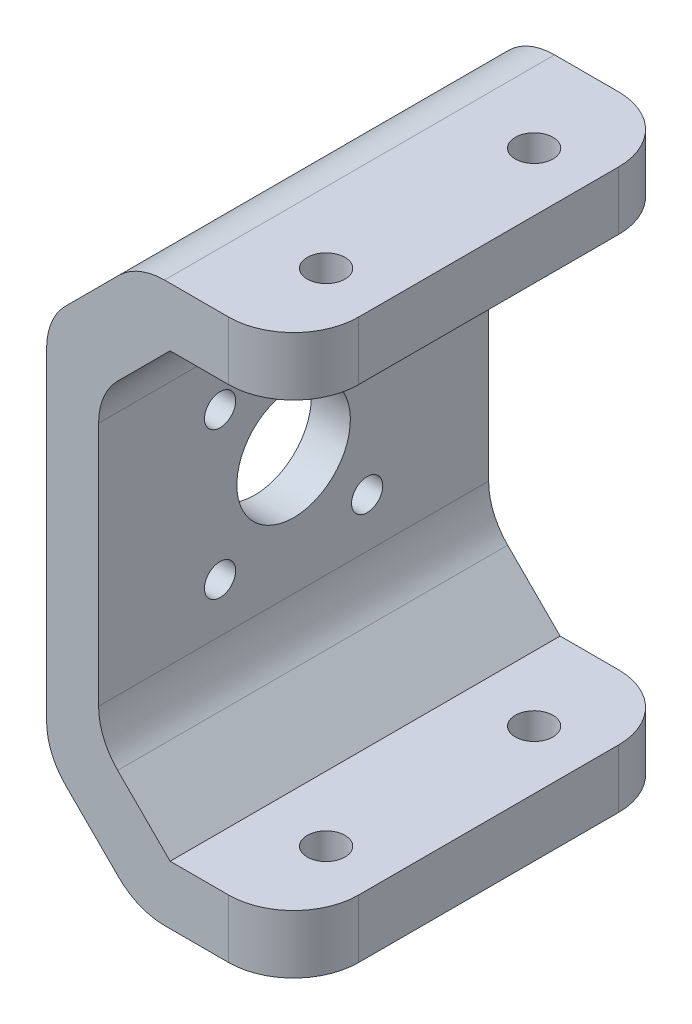
ISO-10303-21;
HEADER;
FILE_DESCRIPTION(('STEP AP214'),'2;1');
FILE_NAME('part.step','',(''),(''),'','','');
FILE_SCHEMA(('AUTOMOTIVE_DESIGN { 1 0 10303 214 1 1 1 1 }'));
ENDSEC;
DATA;
#1=APPLICATION_CONTEXT('core data for automotive mechanical design processes');
#2=APPLICATION_PROTOCOL_DEFINITION('international standard','automotive_design',2000,#1);
#3=PRODUCT_CONTEXT('',#1,'mechanical');
#4=PRODUCT('Part','Part','',(#3));
#5=PRODUCT_RELATED_PRODUCT_CATEGORY('part','',(#4));
#6=PRODUCT_DEFINITION_FORMATION('','',#4);
#7=PRODUCT_DEFINITION_CONTEXT('part definition',#1,'design');
#8=PRODUCT_DEFINITION('design','',#6,#7);
#9=PRODUCT_DEFINITION_SHAPE('','',#8);
#10=(LENGTH_UNIT() NAMED_UNIT(*) SI_UNIT(.MILLI.,.METRE.));
#11=(NAMED_UNIT(*) PLANE_ANGLE_UNIT() SI_UNIT($,.RADIAN.));
#12=(NAMED_UNIT(*) SI_UNIT($,.STERADIAN.) SOLID_ANGLE_UNIT());
#13=UNCERTAINTY_MEASURE_WITH_UNIT(LENGTH_MEASURE(1.E-05),#10,'distance_accuracy_value','');
#14=(GEOMETRIC_REPRESENTATION_CONTEXT(3) GLOBAL_UNCERTAINTY_ASSIGNED_CONTEXT((#13)) GLOBAL_UNIT_ASSIGNED_CONTEXT((#10,
#11,#12)) REPRESENTATION_CONTEXT('',''));
#15=CARTESIAN_POINT('',(0.,0.,0.));
#16=DIRECTION('',(0.,0.,1.));
#17=DIRECTION('',(1.,0.,0.));
#18=AXIS2_PLACEMENT_3D('',#15,#16,#17);
#19=CARTESIAN_POINT('',(0.,0.,0.));
#20=DIRECTION('',(1.,0.,0.));
#21=DIRECTION('',(0.,1.,0.));
#22=AXIS2_PLACEMENT_3D('',#19,#20,#21);
#23=CYLINDRICAL_SURFACE('',#22,4.365625);
#24=CARTESIAN_POINT('',(4.,0.,0.));
#25=DIRECTION('',(-1.,0.,0.));
#26=DIRECTION('',(0.,-1.,0.));
#27=AXIS2_PLACEMENT_3D('',#24,#25,#26);
#28=CIRCLE('',#27,4.365625);
#29=CARTESIAN_POINT('',(4.,-4.365625,0.));
#30=VERTEX_POINT('',#29);
#31=EDGE_CURVE('E395',#30,#30,#28,.T.);
#32=ORIENTED_EDGE('',*,*,#31,.F.);
#33=EDGE_LOOP('',(#32));
#34=FACE_BOUND('',#33,.T.);
#35=CARTESIAN_POINT('',(1.,0.,0.));
#36=DIRECTION('',(-1.,0.,0.));
#37=DIRECTION('',(0.,-1.,0.));
#38=AXIS2_PLACEMENT_3D('',#35,#36,#37);
#39=CIRCLE('',#38,4.365625);
#40=CARTESIAN_POINT('',(1.,-4.365625,0.));
#41=VERTEX_POINT('',#40);
#42=EDGE_CURVE('E374',#41,#41,#39,.F.);
#43=ORIENTED_EDGE('',*,*,#42,.F.);
#44=EDGE_LOOP('',(#43));
#45=FACE_BOUND('',#44,.T.);
#46=ADVANCED_FACE('F41',(#34,#45),#23,.F.);
#47=CARTESIAN_POINT('',(0.,5.656854249492,-5.656854249492));
#48=DIRECTION('',(-1.,0.,0.));
#49=DIRECTION('',(0.,0.,1.));
#50=AXIS2_PLACEMENT_3D('',#47,#48,#49);
#51=CYLINDRICAL_SURFACE('',#50,1.19999999999999);
#52=CARTESIAN_POINT('',(4.,5.656854249492,-5.656854249492));
#53=DIRECTION('',(-1.,0.,0.));
#54=DIRECTION('',(0.,-1.,0.));
#55=AXIS2_PLACEMENT_3D('',#52,#53,#54);
#56=CIRCLE('',#55,1.19999999999999);
#57=CARTESIAN_POINT('',(4.,4.45685424949201,-5.656854249492));
#58=VERTEX_POINT('',#57);
#59=EDGE_CURVE('E392',#58,#58,#56,.T.);
#60=ORIENTED_EDGE('',*,*,#59,.F.);
#61=EDGE_LOOP('',(#60));
#62=FACE_BOUND('',#61,.T.);
#63=CARTESIAN_POINT('',(0.999999999999998,5.656854249492,-5.656854249492));
#64=DIRECTION('',(-1.,0.,0.));
#65=DIRECTION('',(0.,-1.,0.));
#66=AXIS2_PLACEMENT_3D('',#63,#64,#65);
#67=CIRCLE('',#66,1.19999999999999);
#68=CARTESIAN_POINT('',(0.999999999999999,4.45685424949201,-5.656854249492));
#69=VERTEX_POINT('',#68);
#70=EDGE_CURVE('E381',#69,#69,#67,.F.);
#71=ORIENTED_EDGE('',*,*,#70,.F.);
#72=EDGE_LOOP('',(#71));
#73=FACE_BOUND('',#72,.T.);
#74=ADVANCED_FACE('F500',(#62,#73),#51,.F.);
#75=CARTESIAN_POINT('',(0.,-5.656854249492,-5.656854249492));
#76=DIRECTION('',(-1.,0.,0.));
#77=DIRECTION('',(0.,0.,1.));
#78=AXIS2_PLACEMENT_3D('',#75,#76,#77);
#79=CYLINDRICAL_SURFACE('',#78,1.19999999999999);
#80=CARTESIAN_POINT('',(4.,-5.656854249492,-5.656854249492));
#81=DIRECTION('',(-1.,0.,0.));
#82=DIRECTION('',(0.,-1.,0.));
#83=AXIS2_PLACEMENT_3D('',#80,#81,#82);
#84=CIRCLE('',#83,1.19999999999999);
#85=CARTESIAN_POINT('',(4.,-6.85685424949199,-5.656854249492));
#86=VERTEX_POINT('',#85);
#87=EDGE_CURVE('E378',#86,#86,#84,.T.);
#88=ORIENTED_EDGE('',*,*,#87,.F.);
#89=EDGE_LOOP('',(#88));
#90=FACE_BOUND('',#89,.T.);
#91=CARTESIAN_POINT('',(1.,-5.656854249492,-5.656854249492));
#92=DIRECTION('',(-1.,0.,0.));
#93=DIRECTION('',(0.,-1.,0.));
#94=AXIS2_PLACEMENT_3D('',#91,#92,#93);
#95=CIRCLE('',#94,1.19999999999999);
#96=CARTESIAN_POINT('',(1.,-6.85685424949199,-5.656854249492));
#97=VERTEX_POINT('',#96);
#98=EDGE_CURVE('E386',#97,#97,#95,.F.);
#99=ORIENTED_EDGE('',*,*,#98,.F.);
#100=EDGE_LOOP('',(#99));
#101=FACE_BOUND('',#100,.T.);
#102=ADVANCED_FACE('F507',(#90,#101),#79,.F.);
#103=CARTESIAN_POINT('',(0.,-5.656854249492,5.656854249492));
#104=DIRECTION('',(-1.,0.,0.));
#105=DIRECTION('',(0.,0.,1.));
#106=AXIS2_PLACEMENT_3D('',#103,#104,#105);
#107=CYLINDRICAL_SURFACE('',#106,1.19999999999999);
#108=CARTESIAN_POINT('',(4.,-5.656854249492,5.656854249492));
#109=DIRECTION('',(-1.,0.,0.));
#110=DIRECTION('',(0.,-1.,0.));
#111=AXIS2_PLACEMENT_3D('',#108,#109,#110);
#112=CIRCLE('',#111,1.19999999999999);
#113=CARTESIAN_POINT('',(4.,-6.85685424949199,5.656854249492));
#114=VERTEX_POINT('',#113);
#115=EDGE_CURVE('E373',#114,#114,#112,.T.);
#116=ORIENTED_EDGE('',*,*,#115,.F.);
#117=EDGE_LOOP('',(#116));
#118=FACE_BOUND('',#117,.T.);
#119=CARTESIAN_POINT('',(1.,-5.656854249492,5.656854249492));
#120=DIRECTION('',(-1.,0.,0.));
#121=DIRECTION('',(0.,-1.,0.));
#122=AXIS2_PLACEMENT_3D('',#119,#120,#121);
#123=CIRCLE('',#122,1.19999999999999);
#124=CARTESIAN_POINT('',(1.,-6.85685424949199,5.656854249492));
#125=VERTEX_POINT('',#124);
#126=EDGE_CURVE('E816',#125,#125,#123,.F.);
#127=ORIENTED_EDGE('',*,*,#126,.F.);
#128=EDGE_LOOP('',(#127));
#129=FACE_BOUND('',#128,.T.);
#130=ADVANCED_FACE('F741',(#118,#129),#107,.F.);
#131=CARTESIAN_POINT('',(0.,5.656854249492,5.656854249492));
#132=DIRECTION('',(-1.,0.,0.));
#133=DIRECTION('',(0.,0.,1.));
#134=AXIS2_PLACEMENT_3D('',#131,#132,#133);
#135=CYLINDRICAL_SURFACE('',#134,1.19999999999999);
#136=CARTESIAN_POINT('',(4.,5.656854249492,5.656854249492));
#137=DIRECTION('',(-1.,0.,0.));
#138=DIRECTION('',(0.,-1.,0.));
#139=AXIS2_PLACEMENT_3D('',#136,#137,#138);
#140=CIRCLE('',#139,1.19999999999999);
#141=CARTESIAN_POINT('',(4.,4.45685424949201,5.656854249492));
#142=VERTEX_POINT('',#141);
#143=EDGE_CURVE('E371',#142,#142,#140,.T.);
#144=ORIENTED_EDGE('',*,*,#143,.F.);
#145=EDGE_LOOP('',(#144));
#146=FACE_BOUND('',#145,.T.);
#147=CARTESIAN_POINT('',(0.999999999999998,5.656854249492,5.656854249492));
#148=DIRECTION('',(-1.,0.,0.));
#149=DIRECTION('',(0.,-1.,0.));
#150=AXIS2_PLACEMENT_3D('',#147,#148,#149);
#151=CIRCLE('',#150,1.19999999999999);
#152=CARTESIAN_POINT('',(0.999999999999999,4.45685424949201,5.656854249492));
#153=VERTEX_POINT('',#152);
#154=EDGE_CURVE('E227',#153,#153,#151,.F.);
#155=ORIENTED_EDGE('',*,*,#154,.F.);
#156=EDGE_LOOP('',(#155));
#157=FACE_BOUND('',#156,.T.);
#158=ADVANCED_FACE('F548',(#146,#157),#135,.F.);
#159=CARTESIAN_POINT('',(19.,-21.5,15.));
#160=DIRECTION('',(-1.,0.,0.));
#161=DIRECTION('',(0.,0.,1.));
#162=AXIS2_PLACEMENT_3D('',#159,#160,#161);
#163=PLANE('',#162);
#164=DIRECTION('',(0.,0.,-1.));
#165=VECTOR('',#164,1.);
#166=CARTESIAN_POINT('',(19.,-17.,15.));
#167=LINE('',#166,#165);
#168=CARTESIAN_POINT('',(19.,-17.,10.));
#169=VERTEX_POINT('',#168);
#170=CARTESIAN_POINT('',(19.,-17.,-10.));
#171=VERTEX_POINT('',#170);
#172=EDGE_CURVE('E220',#169,#171,#167,.T.);
#173=ORIENTED_EDGE('',*,*,#172,.F.);
#174=DIRECTION('',(0.,1.,0.));
#175=VECTOR('',#174,1.);
#176=CARTESIAN_POINT('',(19.,-21.5,10.));
#177=LINE('',#176,#175);
#178=CARTESIAN_POINT('',(19.,-21.5,10.));
#179=VERTEX_POINT('',#178);
#180=EDGE_CURVE('E259',#169,#179,#177,.F.);
#181=ORIENTED_EDGE('',*,*,#180,.T.);
#182=DIRECTION('',(0.,0.,-1.));
#183=VECTOR('',#182,1.);
#184=CARTESIAN_POINT('',(19.,-21.5,15.));
#185=LINE('',#184,#183);
#186=CARTESIAN_POINT('',(19.,-21.5,-10.));
#187=VERTEX_POINT('',#186);
#188=EDGE_CURVE('E363',#179,#187,#185,.T.);
#189=ORIENTED_EDGE('',*,*,#188,.T.);
#190=DIRECTION('',(0.,1.,0.));
#191=VECTOR('',#190,1.);
#192=CARTESIAN_POINT('',(19.,-21.5,-10.));
#193=LINE('',#192,#191);
#194=EDGE_CURVE('E256',#187,#171,#193,.T.);
#195=ORIENTED_EDGE('',*,*,#194,.T.);
#196=EDGE_LOOP('',(#173,#181,#189,#195));
#197=FACE_BOUND('',#196,.T.);
#198=ADVANCED_FACE('F442',(#197),#163,.F.);
#199=CARTESIAN_POINT('',(19.,-17.,15.));
#200=DIRECTION('',(0.,-1.,0.));
#201=DIRECTION('',(1.,0.,0.));
#202=AXIS2_PLACEMENT_3D('',#199,#200,#201);
#203=PLANE('',#202);
#204=CARTESIAN_POINT('',(14.5,-17.,8.));
#205=DIRECTION('',(0.,-1.,0.));
#206=DIRECTION('',(1.,0.,0.));
#207=AXIS2_PLACEMENT_3D('',#204,#205,#206);
#208=CIRCLE('',#207,1.44999999999999);
#209=CARTESIAN_POINT('',(15.95,-17.,8.));
#210=VERTEX_POINT('',#209);
#211=EDGE_CURVE('E404',#210,#210,#208,.T.);
#212=ORIENTED_EDGE('',*,*,#211,.T.);
#213=EDGE_LOOP('',(#212));
#214=FACE_BOUND('',#213,.T.);
#215=CARTESIAN_POINT('',(14.5,-17.,-8.));
#216=DIRECTION('',(0.,-1.,0.));
#217=DIRECTION('',(1.,0.,0.));
#218=AXIS2_PLACEMENT_3D('',#215,#216,#217);
#219=CIRCLE('',#218,1.44999999999999);
#220=CARTESIAN_POINT('',(15.95,-17.,-8.));
#221=VERTEX_POINT('',#220);
#222=EDGE_CURVE('E216',#221,#221,#219,.T.);
#223=ORIENTED_EDGE('',*,*,#222,.T.);
#224=EDGE_LOOP('',(#223));
#225=FACE_BOUND('',#224,.T.);
#226=DIRECTION('',(-1.,0.,0.));
#227=VECTOR('',#226,1.);
#228=CARTESIAN_POINT('',(19.,-17.,15.));
#229=LINE('',#228,#227);
#230=CARTESIAN_POINT('',(14.,-17.,15.));
#231=VERTEX_POINT('',#230);
#232=CARTESIAN_POINT('',(9.49999999999999,-17.,15.));
#233=VERTEX_POINT('',#232);
#234=EDGE_CURVE('E362',#231,#233,#229,.T.);
#235=ORIENTED_EDGE('',*,*,#234,.F.);
#236=CARTESIAN_POINT('',(14.,-17.,10.));
#237=DIRECTION('',(0.,-1.,0.));
#238=DIRECTION('',(1.,0.,0.));
#239=AXIS2_PLACEMENT_3D('',#236,#237,#238);
#240=CIRCLE('',#239,5.);
#241=EDGE_CURVE('E254',#231,#169,#240,.F.);
#242=ORIENTED_EDGE('',*,*,#241,.T.);
#243=ORIENTED_EDGE('',*,*,#172,.T.);
#244=CARTESIAN_POINT('',(14.,-17.,-10.));
#245=DIRECTION('',(0.,-1.,0.));
#246=DIRECTION('',(1.,0.,0.));
#247=AXIS2_PLACEMENT_3D('',#244,#245,#246);
#248=CIRCLE('',#247,5.);
#249=CARTESIAN_POINT('',(14.,-17.,-15.));
#250=VERTEX_POINT('',#249);
#251=EDGE_CURVE('E214',#171,#250,#248,.F.);
#252=ORIENTED_EDGE('',*,*,#251,.T.);
#253=DIRECTION('',(-1.,0.,0.));
#254=VECTOR('',#253,1.);
#255=CARTESIAN_POINT('',(19.,-17.,-15.));
#256=LINE('',#255,#254);
#257=CARTESIAN_POINT('',(9.49999999999999,-17.,-15.));
#258=VERTEX_POINT('',#257);
#259=EDGE_CURVE('E197',#250,#258,#256,.T.);
#260=ORIENTED_EDGE('',*,*,#259,.T.);
#261=DIRECTION('',(0.,0.,1.));
#262=VECTOR('',#261,1.);
#263=CARTESIAN_POINT('',(9.49999999999999,-17.,15.));
#264=LINE('',#263,#262);
#265=EDGE_CURVE('E211',#258,#233,#264,.T.);
#266=ORIENTED_EDGE('',*,*,#265,.T.);
#267=EDGE_LOOP('',(#235,#242,#243,#252,#260,#266));
#268=FACE_BOUND('',#267,.T.);
#269=ADVANCED_FACE('F210',(#214,#225,#268),#203,.F.);
#270=CARTESIAN_POINT('',(4.00000000000001,-17.,15.));
#271=DIRECTION('',(-1.,0.,0.));
#272=DIRECTION('',(0.,-1.,0.));
#273=AXIS2_PLACEMENT_3D('',#270,#271,#272);
#274=PLANE('',#273);
#275=ORIENTED_EDGE('',*,*,#143,.T.);
#276=EDGE_LOOP('',(#275));
#277=FACE_BOUND('',#276,.T.);
#278=ORIENTED_EDGE('',*,*,#115,.T.);
#279=EDGE_LOOP('',(#278));
#280=FACE_BOUND('',#279,.T.);
#281=ORIENTED_EDGE('',*,*,#87,.T.);
#282=EDGE_LOOP('',(#281));
#283=FACE_BOUND('',#282,.T.);
#284=ORIENTED_EDGE('',*,*,#59,.T.);
#285=EDGE_LOOP('',(#284));
#286=FACE_BOUND('',#285,.T.);
#287=ORIENTED_EDGE('',*,*,#31,.T.);
#288=EDGE_LOOP('',(#287));
#289=FACE_BOUND('',#288,.T.);
#290=DIRECTION('',(0.,1.,0.));
#291=VECTOR('',#290,1.);
#292=CARTESIAN_POINT('',(4.00000000000001,-17.,15.));
#293=LINE('',#292,#291);
#294=CARTESIAN_POINT('',(4.,-9.4289321881345,15.));
#295=VERTEX_POINT('',#294);
#296=CARTESIAN_POINT('',(4.,9.42893218813453,15.));
#297=VERTEX_POINT('',#296);
#298=EDGE_CURVE('E334',#295,#297,#293,.T.);
#299=ORIENTED_EDGE('',*,*,#298,.F.);
#300=DIRECTION('',(0.,0.,1.));
#301=VECTOR('',#300,1.);
#302=CARTESIAN_POINT('',(4.,-9.4289321881345,-15.));
#303=LINE('',#302,#301);
#304=CARTESIAN_POINT('',(4.,-9.4289321881345,-15.));
#305=VERTEX_POINT('',#304);
#306=EDGE_CURVE('E312',#295,#305,#303,.F.);
#307=ORIENTED_EDGE('',*,*,#306,.T.);
#308=DIRECTION('',(0.,1.,0.));
#309=VECTOR('',#308,1.);
#310=CARTESIAN_POINT('',(4.00000000000001,-17.,-15.));
#311=LINE('',#310,#309);
#312=CARTESIAN_POINT('',(4.,9.42893218813453,-15.));
#313=VERTEX_POINT('',#312);
#314=EDGE_CURVE('E215',#305,#313,#311,.T.);
#315=ORIENTED_EDGE('',*,*,#314,.T.);
#316=DIRECTION('',(0.,0.,-1.));
#317=VECTOR('',#316,1.);
#318=CARTESIAN_POINT('',(4.,9.42893218813453,15.));
#319=LINE('',#318,#317);
#320=EDGE_CURVE('E309',#313,#297,#319,.F.);
#321=ORIENTED_EDGE('',*,*,#320,.T.);
#322=EDGE_LOOP('',(#299,#307,#315,#321));
#323=FACE_BOUND('',#322,.T.);
#324=ADVANCED_FACE('F346',(#277,#280,#283,#286,#289,#323),#274,.F.);
#325=CARTESIAN_POINT('',(3.99999999999999,17.,15.));
#326=DIRECTION('',(0.,1.,0.));
#327=DIRECTION('',(0.,0.,1.));
#328=AXIS2_PLACEMENT_3D('',#325,#326,#327);
#329=PLANE('',#328);
#330=CARTESIAN_POINT('',(14.5,17.,8.));
#331=DIRECTION('',(0.,1.,0.));
#332=DIRECTION('',(0.,0.,1.));
#333=AXIS2_PLACEMENT_3D('',#330,#331,#332);
#334=CIRCLE('',#333,1.44999999999999);
#335=CARTESIAN_POINT('',(14.5,17.,9.44999999999999));
#336=VERTEX_POINT('',#335);
#337=EDGE_CURVE('E407',#336,#336,#334,.T.);
#338=ORIENTED_EDGE('',*,*,#337,.T.);
#339=EDGE_LOOP('',(#338));
#340=FACE_BOUND('',#339,.T.);
#341=CARTESIAN_POINT('',(14.5,17.,-8.));
#342=DIRECTION('',(0.,1.,0.));
#343=DIRECTION('',(0.,0.,1.));
#344=AXIS2_PLACEMENT_3D('',#341,#342,#343);
#345=CIRCLE('',#344,1.44999999999999);
#346=CARTESIAN_POINT('',(14.5,17.,-6.55000000000001));
#347=VERTEX_POINT('',#346);
#348=EDGE_CURVE('E416',#347,#347,#345,.T.);
#349=ORIENTED_EDGE('',*,*,#348,.T.);
#350=EDGE_LOOP('',(#349));
#351=FACE_BOUND('',#350,.T.);
#352=DIRECTION('',(1.,0.,0.));
#353=VECTOR('',#352,1.);
#354=CARTESIAN_POINT('',(3.99999999999999,17.,-15.));
#355=LINE('',#354,#353);
#356=CARTESIAN_POINT('',(9.50000000000004,17.,-15.));
#357=VERTEX_POINT('',#356);
#358=CARTESIAN_POINT('',(14.,17.,-15.));
#359=VERTEX_POINT('',#358);
#360=EDGE_CURVE('E348',#357,#359,#355,.T.);
#361=ORIENTED_EDGE('',*,*,#360,.T.);
#362=CARTESIAN_POINT('',(14.,17.,-10.));
#363=DIRECTION('',(0.,1.,0.));
#364=DIRECTION('',(0.,0.,1.));
#365=AXIS2_PLACEMENT_3D('',#362,#363,#364);
#366=CIRCLE('',#365,5.);
#367=CARTESIAN_POINT('',(19.,17.,-10.));
#368=VERTEX_POINT('',#367);
#369=EDGE_CURVE('E281',#359,#368,#366,.F.);
#370=ORIENTED_EDGE('',*,*,#369,.T.);
#371=DIRECTION('',(0.,0.,-1.));
#372=VECTOR('',#371,1.);
#373=CARTESIAN_POINT('',(19.,17.,15.));
#374=LINE('',#373,#372);
#375=CARTESIAN_POINT('',(19.,17.,10.));
#376=VERTEX_POINT('',#375);
#377=EDGE_CURVE('E224',#376,#368,#374,.T.);
#378=ORIENTED_EDGE('',*,*,#377,.F.);
#379=CARTESIAN_POINT('',(14.,17.,10.));
#380=DIRECTION('',(0.,1.,0.));
#381=DIRECTION('',(0.,0.,1.));
#382=AXIS2_PLACEMENT_3D('',#379,#380,#381);
#383=CIRCLE('',#382,5.);
#384=CARTESIAN_POINT('',(14.,17.,15.));
#385=VERTEX_POINT('',#384);
#386=EDGE_CURVE('E279',#376,#385,#383,.F.);
#387=ORIENTED_EDGE('',*,*,#386,.T.);
#388=DIRECTION('',(1.,0.,0.));
#389=VECTOR('',#388,1.);
#390=CARTESIAN_POINT('',(3.99999999999999,17.,15.));
#391=LINE('',#390,#389);
#392=CARTESIAN_POINT('',(9.50000000000004,17.,15.));
#393=VERTEX_POINT('',#392);
#394=EDGE_CURVE('E423',#393,#385,#391,.T.);
#395=ORIENTED_EDGE('',*,*,#394,.F.);
#396=DIRECTION('',(0.,0.,-1.));
#397=VECTOR('',#396,1.);
#398=CARTESIAN_POINT('',(9.50000000000004,17.,-15.));
#399=LINE('',#398,#397);
#400=EDGE_CURVE('E205',#393,#357,#399,.T.);
#401=ORIENTED_EDGE('',*,*,#400,.T.);
#402=EDGE_LOOP('',(#361,#370,#378,#387,#395,#401));
#403=FACE_BOUND('',#402,.T.);
#404=ADVANCED_FACE('F485',(#340,#351,#403),#329,.F.);
#405=CARTESIAN_POINT('',(19.,17.,15.));
#406=DIRECTION('',(-1.,0.,0.));
#407=DIRECTION('',(0.,-1.,0.));
#408=AXIS2_PLACEMENT_3D('',#405,#406,#407);
#409=PLANE('',#408);
#410=ORIENTED_EDGE('',*,*,#377,.T.);
#411=DIRECTION('',(0.,1.,0.));
#412=VECTOR('',#411,1.);
#413=CARTESIAN_POINT('',(19.,17.,-10.));
#414=LINE('',#413,#412);
#415=CARTESIAN_POINT('',(19.,21.5,-10.));
#416=VERTEX_POINT('',#415);
#417=EDGE_CURVE('E272',#368,#416,#414,.T.);
#418=ORIENTED_EDGE('',*,*,#417,.T.);
#419=DIRECTION('',(0.,0.,-1.));
#420=VECTOR('',#419,1.);
#421=CARTESIAN_POINT('',(19.,21.5,15.));
#422=LINE('',#421,#420);
#423=CARTESIAN_POINT('',(19.,21.5,10.));
#424=VERTEX_POINT('',#423);
#425=EDGE_CURVE('E366',#424,#416,#422,.T.);
#426=ORIENTED_EDGE('',*,*,#425,.F.);
#427=DIRECTION('',(0.,1.,0.));
#428=VECTOR('',#427,1.);
#429=CARTESIAN_POINT('',(19.,17.,10.));
#430=LINE('',#429,#428);
#431=EDGE_CURVE('E270',#424,#376,#430,.F.);
#432=ORIENTED_EDGE('',*,*,#431,.T.);
#433=EDGE_LOOP('',(#410,#418,#426,#432));
#434=FACE_BOUND('',#433,.T.);
#435=ADVANCED_FACE('F480',(#434),#409,.F.);
#436=CARTESIAN_POINT('',(19.,21.5,15.));
#437=DIRECTION('',(0.,-1.,0.));
#438=DIRECTION('',(1.,0.,0.));
#439=AXIS2_PLACEMENT_3D('',#436,#437,#438);
#440=PLANE('',#439);
#441=CARTESIAN_POINT('',(14.5,21.5,8.));
#442=DIRECTION('',(0.,-1.,0.));
#443=DIRECTION('',(0.,0.,-1.));
#444=AXIS2_PLACEMENT_3D('',#441,#442,#443);
#445=CIRCLE('',#444,1.44999999999999);
#446=CARTESIAN_POINT('',(14.5,21.5,6.55000000000001));
#447=VERTEX_POINT('',#446);
#448=EDGE_CURVE('E401',#447,#447,#445,.T.);
#449=ORIENTED_EDGE('',*,*,#448,.T.);
#450=EDGE_LOOP('',(#449));
#451=FACE_BOUND('',#450,.T.);
#452=CARTESIAN_POINT('',(14.5,21.5,-8.));
#453=DIRECTION('',(0.,-1.,0.));
#454=DIRECTION('',(0.,0.,-1.));
#455=AXIS2_PLACEMENT_3D('',#452,#453,#454);
#456=CIRCLE('',#455,1.44999999999999);
#457=CARTESIAN_POINT('',(14.5,21.5,-9.44999999999999));
#458=VERTEX_POINT('',#457);
#459=EDGE_CURVE('E413',#458,#458,#456,.T.);
#460=ORIENTED_EDGE('',*,*,#459,.T.);
#461=EDGE_LOOP('',(#460));
#462=FACE_BOUND('',#461,.T.);
#463=DIRECTION('',(-1.,0.,0.));
#464=VECTOR('',#463,1.);
#465=CARTESIAN_POINT('',(19.,21.5,-15.));
#466=LINE('',#465,#464);
#467=CARTESIAN_POINT('',(14.,21.5,-15.));
#468=VERTEX_POINT('',#467);
#469=CARTESIAN_POINT('',(9.07106781186549,21.5,-15.));
#470=VERTEX_POINT('',#469);
#471=EDGE_CURVE('E351',#468,#470,#466,.T.);
#472=ORIENTED_EDGE('',*,*,#471,.T.);
#473=DIRECTION('',(0.,0.,-1.));
#474=VECTOR('',#473,1.);
#475=CARTESIAN_POINT('',(9.07106781186549,21.5,15.));
#476=LINE('',#475,#474);
#477=CARTESIAN_POINT('',(9.07106781186549,21.5,15.));
#478=VERTEX_POINT('',#477);
#479=EDGE_CURVE('E319',#470,#478,#476,.F.);
#480=ORIENTED_EDGE('',*,*,#479,.T.);
#481=DIRECTION('',(-1.,0.,0.));
#482=VECTOR('',#481,1.);
#483=CARTESIAN_POINT('',(19.,21.5,15.));
#484=LINE('',#483,#482);
#485=CARTESIAN_POINT('',(14.,21.5,15.));
#486=VERTEX_POINT('',#485);
#487=EDGE_CURVE('E425',#486,#478,#484,.T.);
#488=ORIENTED_EDGE('',*,*,#487,.F.);
#489=CARTESIAN_POINT('',(14.,21.5,10.));
#490=DIRECTION('',(0.,-1.,0.));
#491=DIRECTION('',(1.,0.,0.));
#492=AXIS2_PLACEMENT_3D('',#489,#490,#491);
#493=CIRCLE('',#492,5.);
#494=EDGE_CURVE('E275',#486,#424,#493,.F.);
#495=ORIENTED_EDGE('',*,*,#494,.T.);
#496=ORIENTED_EDGE('',*,*,#425,.T.);
#497=CARTESIAN_POINT('',(14.,21.5,-10.));
#498=DIRECTION('',(0.,-1.,0.));
#499=DIRECTION('',(1.,0.,0.));
#500=AXIS2_PLACEMENT_3D('',#497,#498,#499);
#501=CIRCLE('',#500,5.);
#502=EDGE_CURVE('E277',#416,#468,#501,.F.);
#503=ORIENTED_EDGE('',*,*,#502,.T.);
#504=EDGE_LOOP('',(#472,#480,#488,#495,#496,#503));
#505=FACE_BOUND('',#504,.T.);
#506=ADVANCED_FACE('F472',(#451,#462,#505),#440,.F.);
#507=CARTESIAN_POINT('',(0.,21.5,15.));
#508=DIRECTION('',(1.,0.,0.));
#509=DIRECTION('',(0.,1.,0.));
#510=AXIS2_PLACEMENT_3D('',#507,#508,#509);
#511=PLANE('',#510);
#512=CARTESIAN_POINT('',(0.,0.,0.));
#513=DIRECTION('',(-1.,0.,0.));
#514=DIRECTION('',(0.,-1.,0.));
#515=AXIS2_PLACEMENT_3D('',#512,#513,#514);
#516=CIRCLE('',#515,11.5);
#517=CARTESIAN_POINT('',(0.,-11.5,0.));
#518=VERTEX_POINT('',#517);
#519=EDGE_CURVE('E812',#518,#518,#516,.T.);
#520=ORIENTED_EDGE('',*,*,#519,.F.);
#521=EDGE_LOOP('',(#520));
#522=FACE_BOUND('',#521,.T.);
#523=DIRECTION('',(0.,-1.,0.));
#524=VECTOR('',#523,1.);
#525=CARTESIAN_POINT('',(0.,21.5,-15.));
#526=LINE('',#525,#524);
#527=CARTESIAN_POINT('',(0.,12.4289321881345,-15.));
#528=VERTEX_POINT('',#527);
#529=CARTESIAN_POINT('',(0.,-12.4289321881345,-15.));
#530=VERTEX_POINT('',#529);
#531=EDGE_CURVE('E357',#528,#530,#526,.T.);
#532=ORIENTED_EDGE('',*,*,#531,.T.);
#533=DIRECTION('',(0.,0.,-1.));
#534=VECTOR('',#533,1.);
#535=CARTESIAN_POINT('',(0.,-12.4289321881345,15.));
#536=LINE('',#535,#534);
#537=CARTESIAN_POINT('',(0.,-12.4289321881345,15.));
#538=VERTEX_POINT('',#537);
#539=EDGE_CURVE('E307',#530,#538,#536,.F.);
#540=ORIENTED_EDGE('',*,*,#539,.T.);
#541=DIRECTION('',(0.,-1.,0.));
#542=VECTOR('',#541,1.);
#543=CARTESIAN_POINT('',(0.,21.5,15.));
#544=LINE('',#543,#542);
#545=CARTESIAN_POINT('',(0.,12.4289321881345,15.));
#546=VERTEX_POINT('',#545);
#547=EDGE_CURVE('E428',#546,#538,#544,.T.);
#548=ORIENTED_EDGE('',*,*,#547,.F.);
#549=DIRECTION('',(0.,0.,1.));
#550=VECTOR('',#549,1.);
#551=CARTESIAN_POINT('',(0.,12.4289321881345,-15.));
#552=LINE('',#551,#550);
#553=EDGE_CURVE('E304',#546,#528,#552,.F.);
#554=ORIENTED_EDGE('',*,*,#553,.T.);
#555=EDGE_LOOP('',(#532,#540,#548,#554));
#556=FACE_BOUND('',#555,.T.);
#557=ADVANCED_FACE('F456',(#522,#556),#511,.F.);
#558=CARTESIAN_POINT('',(0.,-21.5,15.));
#559=DIRECTION('',(0.,1.,0.));
#560=DIRECTION('',(-1.,0.,0.));
#561=AXIS2_PLACEMENT_3D('',#558,#559,#560);
#562=PLANE('',#561);
#563=CARTESIAN_POINT('',(14.5,-21.5,8.));
#564=DIRECTION('',(0.,-1.,0.));
#565=DIRECTION('',(0.,0.,-1.));
#566=AXIS2_PLACEMENT_3D('',#563,#564,#565);
#567=CIRCLE('',#566,1.45);
#568=CARTESIAN_POINT('',(14.5,-21.5,6.55));
#569=VERTEX_POINT('',#568);
#570=EDGE_CURVE('E398',#569,#569,#567,.T.);
#571=ORIENTED_EDGE('',*,*,#570,.F.);
#572=EDGE_LOOP('',(#571));
#573=FACE_BOUND('',#572,.T.);
#574=CARTESIAN_POINT('',(14.5,-21.5,-8.));
#575=DIRECTION('',(0.,-1.,0.));
#576=DIRECTION('',(0.,0.,-1.));
#577=AXIS2_PLACEMENT_3D('',#574,#575,#576);
#578=CIRCLE('',#577,1.45);
#579=CARTESIAN_POINT('',(14.5,-21.5,-9.45));
#580=VERTEX_POINT('',#579);
#581=EDGE_CURVE('E410',#580,#580,#578,.T.);
#582=ORIENTED_EDGE('',*,*,#581,.F.);
#583=EDGE_LOOP('',(#582));
#584=FACE_BOUND('',#583,.T.);
#585=DIRECTION('',(1.,0.,0.));
#586=VECTOR('',#585,1.);
#587=CARTESIAN_POINT('',(0.,-21.5,15.));
#588=LINE('',#587,#586);
#589=CARTESIAN_POINT('',(9.07106781186548,-21.5,15.));
#590=VERTEX_POINT('',#589);
#591=CARTESIAN_POINT('',(14.,-21.5,15.));
#592=VERTEX_POINT('',#591);
#593=EDGE_CURVE('E367',#590,#592,#588,.T.);
#594=ORIENTED_EDGE('',*,*,#593,.F.);
#595=DIRECTION('',(0.,0.,1.));
#596=VECTOR('',#595,1.);
#597=CARTESIAN_POINT('',(9.07106781186548,-21.5,-15.));
#598=LINE('',#597,#596);
#599=CARTESIAN_POINT('',(9.07106781186548,-21.5,-15.));
#600=VERTEX_POINT('',#599);
#601=EDGE_CURVE('E283',#590,#600,#598,.F.);
#602=ORIENTED_EDGE('',*,*,#601,.T.);
#603=DIRECTION('',(1.,0.,0.));
#604=VECTOR('',#603,1.);
#605=CARTESIAN_POINT('',(0.,-21.5,-15.));
#606=LINE('',#605,#604);
#607=CARTESIAN_POINT('',(14.,-21.5,-15.));
#608=VERTEX_POINT('',#607);
#609=EDGE_CURVE('E360',#600,#608,#606,.T.);
#610=ORIENTED_EDGE('',*,*,#609,.T.);
#611=CARTESIAN_POINT('',(14.,-21.5,-10.));
#612=DIRECTION('',(0.,1.,0.));
#613=DIRECTION('',(-1.,0.,0.));
#614=AXIS2_PLACEMENT_3D('',#611,#612,#613);
#615=CIRCLE('',#614,5.);
#616=EDGE_CURVE('E261',#608,#187,#615,.F.);
#617=ORIENTED_EDGE('',*,*,#616,.T.);
#618=ORIENTED_EDGE('',*,*,#188,.F.);
#619=CARTESIAN_POINT('',(14.,-21.5,10.));
#620=DIRECTION('',(0.,1.,0.));
#621=DIRECTION('',(-1.,0.,0.));
#622=AXIS2_PLACEMENT_3D('',#619,#620,#621);
#623=CIRCLE('',#622,5.);
#624=EDGE_CURVE('E263',#179,#592,#623,.F.);
#625=ORIENTED_EDGE('',*,*,#624,.T.);
#626=EDGE_LOOP('',(#594,#602,#610,#617,#618,#625));
#627=FACE_BOUND('',#626,.T.);
#628=ADVANCED_FACE('F436',(#573,#584,#627),#562,.F.);
#629=CARTESIAN_POINT('',(0.,0.,15.));
#630=DIRECTION('',(0.,0.,1.));
#631=DIRECTION('',(1.,0.,0.));
#632=AXIS2_PLACEMENT_3D('',#629,#630,#631);
#633=PLANE('',#632);
#634=DIRECTION('',(-0.707106781186547,0.707106781186548,0.));
#635=VECTOR('',#634,1.);
#636=CARTESIAN_POINT('',(-7.24999999999999,-7.24999999999997,15.));
#637=LINE('',#636,#635);
#638=CARTESIAN_POINT('',(1.46446609406726,-15.9644660940672,15.));
#639=VERTEX_POINT('',#638);
#640=CARTESIAN_POINT('',(5.53553390593274,-20.0355339059327,15.));
#641=VERTEX_POINT('',#640);
#642=EDGE_CURVE('E242',#639,#641,#637,.F.);
#643=ORIENTED_EDGE('',*,*,#642,.T.);
#644=CARTESIAN_POINT('',(9.07106781186548,-16.5,15.));
#645=DIRECTION('',(0.,0.,1.));
#646=DIRECTION('',(1.,0.,0.));
#647=AXIS2_PLACEMENT_3D('',#644,#645,#646);
#648=CIRCLE('',#647,5.);
#649=EDGE_CURVE('E302',#641,#590,#648,.T.);
#650=ORIENTED_EDGE('',*,*,#649,.T.);
#651=ORIENTED_EDGE('',*,*,#593,.T.);
#652=DIRECTION('',(0.,1.,0.));
#653=VECTOR('',#652,1.);
#654=CARTESIAN_POINT('',(14.,-17.,15.));
#655=LINE('',#654,#653);
#656=EDGE_CURVE('E250',#592,#231,#655,.T.);
#657=ORIENTED_EDGE('',*,*,#656,.T.);
#658=ORIENTED_EDGE('',*,*,#234,.T.);
#659=DIRECTION('',(0.707106781186545,-0.70710678118655,0.));
#660=VECTOR('',#659,1.);
#661=CARTESIAN_POINT('',(4.,-11.5,15.));
#662=LINE('',#661,#660);
#663=CARTESIAN_POINT('',(5.46446609406725,-12.9644660940672,15.));
#664=VERTEX_POINT('',#663);
#665=EDGE_CURVE('E204',#233,#664,#662,.F.);
#666=ORIENTED_EDGE('',*,*,#665,.T.);
#667=CARTESIAN_POINT('',(9.,-9.4289321881345,15.));
#668=DIRECTION('',(0.,0.,1.));
#669=DIRECTION('',(1.,0.,0.));
#670=AXIS2_PLACEMENT_3D('',#667,#668,#669);
#671=CIRCLE('',#670,5.);
#672=EDGE_CURVE('E327',#664,#295,#671,.F.);
#673=ORIENTED_EDGE('',*,*,#672,.T.);
#674=ORIENTED_EDGE('',*,*,#298,.T.);
#675=CARTESIAN_POINT('',(9.,9.42893218813453,15.));
#676=DIRECTION('',(0.,0.,1.));
#677=DIRECTION('',(1.,0.,0.));
#678=AXIS2_PLACEMENT_3D('',#675,#676,#677);
#679=CIRCLE('',#678,5.);
#680=CARTESIAN_POINT('',(5.46446609406728,12.9644660940673,15.));
#681=VERTEX_POINT('',#680);
#682=EDGE_CURVE('E49',#297,#681,#679,.F.);
#683=ORIENTED_EDGE('',*,*,#682,.T.);
#684=DIRECTION('',(-0.707106781186552,-0.707106781186544,0.));
#685=VECTOR('',#684,1.);
#686=CARTESIAN_POINT('',(9.50000000000004,17.,15.));
#687=LINE('',#686,#685);
#688=EDGE_CURVE('E234',#681,#393,#687,.F.);
#689=ORIENTED_EDGE('',*,*,#688,.T.);
#690=ORIENTED_EDGE('',*,*,#394,.T.);
#691=DIRECTION('',(0.,1.,0.));
#692=VECTOR('',#691,1.);
#693=CARTESIAN_POINT('',(14.,21.5,15.));
#694=LINE('',#693,#692);
#695=EDGE_CURVE('E247',#385,#486,#694,.T.);
#696=ORIENTED_EDGE('',*,*,#695,.T.);
#697=ORIENTED_EDGE('',*,*,#487,.T.);
#698=CARTESIAN_POINT('',(9.07106781186549,16.5,15.));
#699=DIRECTION('',(0.,0.,1.));
#700=DIRECTION('',(1.,0.,0.));
#701=AXIS2_PLACEMENT_3D('',#698,#699,#700);
#702=CIRCLE('',#701,5.);
#703=CARTESIAN_POINT('',(5.53553390593276,20.0355339059327,15.));
#704=VERTEX_POINT('',#703);
#705=EDGE_CURVE('E299',#478,#704,#702,.T.);
#706=ORIENTED_EDGE('',*,*,#705,.T.);
#707=DIRECTION('',(0.707106781186549,0.707106781186547,0.));
#708=VECTOR('',#707,1.);
#709=CARTESIAN_POINT('',(-7.25,7.25000000000002,15.));
#710=LINE('',#709,#708);
#711=CARTESIAN_POINT('',(1.46446609406726,15.9644660940673,15.));
#712=VERTEX_POINT('',#711);
#713=EDGE_CURVE('E245',#704,#712,#710,.F.);
#714=ORIENTED_EDGE('',*,*,#713,.T.);
#715=CARTESIAN_POINT('',(4.99999999999999,12.4289321881345,15.));
#716=DIRECTION('',(0.,0.,1.));
#717=DIRECTION('',(1.,0.,0.));
#718=AXIS2_PLACEMENT_3D('',#715,#716,#717);
#719=CIRCLE('',#718,5.);
#720=EDGE_CURVE('E64',#712,#546,#719,.T.);
#721=ORIENTED_EDGE('',*,*,#720,.T.);
#722=ORIENTED_EDGE('',*,*,#547,.T.);
#723=CARTESIAN_POINT('',(5.,-12.4289321881345,15.));
#724=DIRECTION('',(0.,0.,1.));
#725=DIRECTION('',(1.,0.,0.));
#726=AXIS2_PLACEMENT_3D('',#723,#724,#725);
#727=CIRCLE('',#726,5.);
#728=EDGE_CURVE('E56',#538,#639,#727,.T.);
#729=ORIENTED_EDGE('',*,*,#728,.T.);
#730=EDGE_LOOP('',(#643,#650,#651,#657,#658,#666,#673,#674,#683,#689,#690,#696,#697,#706,#714,
#721,#722,#729));
#731=FACE_BOUND('',#730,.T.);
#732=ADVANCED_FACE('F330',(#731),#633,.T.);
#733=CARTESIAN_POINT('',(0.,0.,-15.));
#734=DIRECTION('',(0.,0.,1.));
#735=DIRECTION('',(1.,0.,0.));
#736=AXIS2_PLACEMENT_3D('',#733,#734,#735);
#737=PLANE('',#736);
#738=ORIENTED_EDGE('',*,*,#609,.F.);
#739=CARTESIAN_POINT('',(9.07106781186548,-16.5,-15.));
#740=DIRECTION('',(0.,0.,1.));
#741=DIRECTION('',(1.,0.,0.));
#742=AXIS2_PLACEMENT_3D('',#739,#740,#741);
#743=CIRCLE('',#742,5.);
#744=CARTESIAN_POINT('',(5.53553390593274,-20.0355339059327,-15.));
#745=VERTEX_POINT('',#744);
#746=EDGE_CURVE('E292',#600,#745,#743,.F.);
#747=ORIENTED_EDGE('',*,*,#746,.T.);
#748=DIRECTION('',(0.707106781186547,-0.707106781186548,0.));
#749=VECTOR('',#748,1.);
#750=CARTESIAN_POINT('',(7.,-21.5,-15.));
#751=LINE('',#750,#749);
#752=CARTESIAN_POINT('',(1.46446609406726,-15.9644660940672,-15.));
#753=VERTEX_POINT('',#752);
#754=EDGE_CURVE('E236',#745,#753,#751,.F.);
#755=ORIENTED_EDGE('',*,*,#754,.T.);
#756=CARTESIAN_POINT('',(5.,-12.4289321881345,-15.));
#757=DIRECTION('',(0.,0.,1.));
#758=DIRECTION('',(1.,0.,0.));
#759=AXIS2_PLACEMENT_3D('',#756,#757,#758);
#760=CIRCLE('',#759,5.);
#761=EDGE_CURVE('E290',#753,#530,#760,.F.);
#762=ORIENTED_EDGE('',*,*,#761,.T.);
#763=ORIENTED_EDGE('',*,*,#531,.F.);
#764=CARTESIAN_POINT('',(4.99999999999999,12.4289321881345,-15.));
#765=DIRECTION('',(0.,0.,1.));
#766=DIRECTION('',(1.,0.,0.));
#767=AXIS2_PLACEMENT_3D('',#764,#765,#766);
#768=CIRCLE('',#767,5.);
#769=CARTESIAN_POINT('',(1.46446609406726,15.9644660940673,-15.));
#770=VERTEX_POINT('',#769);
#771=EDGE_CURVE('E286',#528,#770,#768,.F.);
#772=ORIENTED_EDGE('',*,*,#771,.T.);
#773=DIRECTION('',(-0.707106781186549,-0.707106781186547,0.));
#774=VECTOR('',#773,1.);
#775=CARTESIAN_POINT('',(0.,14.5,-15.));
#776=LINE('',#775,#774);
#777=CARTESIAN_POINT('',(5.53553390593276,20.0355339059327,-15.));
#778=VERTEX_POINT('',#777);
#779=EDGE_CURVE('E239',#770,#778,#776,.F.);
#780=ORIENTED_EDGE('',*,*,#779,.T.);
#781=CARTESIAN_POINT('',(9.07106781186549,16.5,-15.));
#782=DIRECTION('',(0.,0.,1.));
#783=DIRECTION('',(1.,0.,0.));
#784=AXIS2_PLACEMENT_3D('',#781,#782,#783);
#785=CIRCLE('',#784,5.);
#786=EDGE_CURVE('E288',#778,#470,#785,.F.);
#787=ORIENTED_EDGE('',*,*,#786,.T.);
#788=ORIENTED_EDGE('',*,*,#471,.F.);
#789=DIRECTION('',(0.,1.,0.));
#790=VECTOR('',#789,1.);
#791=CARTESIAN_POINT('',(14.,0.,-15.));
#792=LINE('',#791,#790);
#793=EDGE_CURVE('E266',#468,#359,#792,.F.);
#794=ORIENTED_EDGE('',*,*,#793,.T.);
#795=ORIENTED_EDGE('',*,*,#360,.F.);
#796=DIRECTION('',(0.707106781186552,0.707106781186544,0.));
#797=VECTOR('',#796,1.);
#798=CARTESIAN_POINT('',(-3.75000000000004,3.75000000000008,-15.));
#799=LINE('',#798,#797);
#800=CARTESIAN_POINT('',(5.46446609406728,12.9644660940673,-15.));
#801=VERTEX_POINT('',#800);
#802=EDGE_CURVE('E231',#357,#801,#799,.F.);
#803=ORIENTED_EDGE('',*,*,#802,.T.);
#804=CARTESIAN_POINT('',(9.,9.42893218813453,-15.));
#805=DIRECTION('',(0.,0.,1.));
#806=DIRECTION('',(1.,0.,0.));
#807=AXIS2_PLACEMENT_3D('',#804,#805,#806);
#808=CIRCLE('',#807,5.);
#809=EDGE_CURVE('E11',#801,#313,#808,.T.);
#810=ORIENTED_EDGE('',*,*,#809,.T.);
#811=ORIENTED_EDGE('',*,*,#314,.F.);
#812=CARTESIAN_POINT('',(9.,-9.4289321881345,-15.));
#813=DIRECTION('',(0.,0.,1.));
#814=DIRECTION('',(1.,0.,0.));
#815=AXIS2_PLACEMENT_3D('',#812,#813,#814);
#816=CIRCLE('',#815,5.);
#817=CARTESIAN_POINT('',(5.46446609406725,-12.9644660940672,-15.));
#818=VERTEX_POINT('',#817);
#819=EDGE_CURVE('E200',#305,#818,#816,.T.);
#820=ORIENTED_EDGE('',*,*,#819,.T.);
#821=DIRECTION('',(-0.707106781186545,0.70710678118655,0.));
#822=VECTOR('',#821,1.);
#823=CARTESIAN_POINT('',(-3.74999999999996,-3.74999999999993,-15.));
#824=LINE('',#823,#822);
#825=EDGE_CURVE('E192',#818,#258,#824,.F.);
#826=ORIENTED_EDGE('',*,*,#825,.T.);
#827=ORIENTED_EDGE('',*,*,#259,.F.);
#828=DIRECTION('',(0.,1.,0.));
#829=VECTOR('',#828,1.);
#830=CARTESIAN_POINT('',(14.,0.,-15.));
#831=LINE('',#830,#829);
#832=EDGE_CURVE('E268',#250,#608,#831,.F.);
#833=ORIENTED_EDGE('',*,*,#832,.T.);
#834=EDGE_LOOP('',(#738,#747,#755,#762,#763,#772,#780,#787,#788,#794,#795,#803,#810,#811,#820,
#826,#827,#833));
#835=FACE_BOUND('',#834,.T.);
#836=ADVANCED_FACE('F195',(#835),#737,.F.);
#837=CARTESIAN_POINT('',(14.5,-21.5,-8.));
#838=DIRECTION('',(0.,-1.,0.));
#839=DIRECTION('',(0.,0.,-1.));
#840=AXIS2_PLACEMENT_3D('',#837,#838,#839);
#841=CYLINDRICAL_SURFACE('',#840,1.44999999999999);
#842=ORIENTED_EDGE('',*,*,#459,.F.);
#843=EDGE_LOOP('',(#842));
#844=FACE_BOUND('',#843,.T.);
#845=ORIENTED_EDGE('',*,*,#348,.F.);
#846=EDGE_LOOP('',(#845));
#847=FACE_BOUND('',#846,.T.);
#848=ADVANCED_FACE('F522',(#844,#847),#841,.F.);
#849=ORIENTED_EDGE('',*,*,#581,.T.);
#850=EDGE_LOOP('',(#849));
#851=FACE_BOUND('',#850,.T.);
#852=ORIENTED_EDGE('',*,*,#222,.F.);
#853=EDGE_LOOP('',(#852));
#854=FACE_BOUND('',#853,.T.);
#855=ADVANCED_FACE('F518',(#851,#854),#841,.F.);
#856=CARTESIAN_POINT('',(14.5,-21.5,8.));
#857=DIRECTION('',(0.,-1.,0.));
#858=DIRECTION('',(0.,0.,-1.));
#859=AXIS2_PLACEMENT_3D('',#856,#857,#858);
#860=CYLINDRICAL_SURFACE('',#859,1.44999999999999);
#861=ORIENTED_EDGE('',*,*,#448,.F.);
#862=EDGE_LOOP('',(#861));
#863=FACE_BOUND('',#862,.T.);
#864=ORIENTED_EDGE('',*,*,#337,.F.);
#865=EDGE_LOOP('',(#864));
#866=FACE_BOUND('',#865,.T.);
#867=ADVANCED_FACE('F514',(#863,#866),#860,.F.);
#868=ORIENTED_EDGE('',*,*,#570,.T.);
#869=EDGE_LOOP('',(#868));
#870=FACE_BOUND('',#869,.T.);
#871=ORIENTED_EDGE('',*,*,#211,.F.);
#872=EDGE_LOOP('',(#871));
#873=FACE_BOUND('',#872,.T.);
#874=ADVANCED_FACE('F517',(#870,#873),#860,.F.);
#875=CARTESIAN_POINT('',(1.,0.,0.));
#876=DIRECTION('',(-1.,0.,0.));
#877=DIRECTION('',(0.,-1.,0.));
#878=AXIS2_PLACEMENT_3D('',#875,#876,#877);
#879=PLANE('',#878);
#880=CARTESIAN_POINT('',(1.,0.,0.));
#881=DIRECTION('',(-1.,0.,0.));
#882=DIRECTION('',(0.,-1.,0.));
#883=AXIS2_PLACEMENT_3D('',#880,#881,#882);
#884=CIRCLE('',#883,11.5);
#885=CARTESIAN_POINT('',(1.,-11.5,0.));
#886=VERTEX_POINT('',#885);
#887=EDGE_CURVE('E809',#886,#886,#884,.T.);
#888=ORIENTED_EDGE('',*,*,#887,.T.);
#889=EDGE_LOOP('',(#888));
#890=FACE_BOUND('',#889,.T.);
#891=ORIENTED_EDGE('',*,*,#154,.T.);
#892=EDGE_LOOP('',(#891));
#893=FACE_BOUND('',#892,.T.);
#894=ORIENTED_EDGE('',*,*,#126,.T.);
#895=EDGE_LOOP('',(#894));
#896=FACE_BOUND('',#895,.T.);
#897=ORIENTED_EDGE('',*,*,#98,.T.);
#898=EDGE_LOOP('',(#897));
#899=FACE_BOUND('',#898,.T.);
#900=ORIENTED_EDGE('',*,*,#70,.T.);
#901=EDGE_LOOP('',(#900));
#902=FACE_BOUND('',#901,.T.);
#903=ORIENTED_EDGE('',*,*,#42,.T.);
#904=EDGE_LOOP('',(#903));
#905=FACE_BOUND('',#904,.T.);
#906=ADVANCED_FACE('F733',(#890,#893,#896,#899,#902,#905),#879,.T.);
#907=CARTESIAN_POINT('',(1.,0.,0.));
#908=DIRECTION('',(-1.,0.,0.));
#909=DIRECTION('',(0.,-1.,0.));
#910=AXIS2_PLACEMENT_3D('',#907,#908,#909);
#911=CYLINDRICAL_SURFACE('',#910,11.5);
#912=ORIENTED_EDGE('',*,*,#887,.F.);
#913=EDGE_LOOP('',(#912));
#914=FACE_BOUND('',#913,.T.);
#915=ORIENTED_EDGE('',*,*,#519,.T.);
#916=EDGE_LOOP('',(#915));
#917=FACE_BOUND('',#916,.T.);
#918=ADVANCED_FACE('F555',(#914,#917),#911,.F.);
#919=CARTESIAN_POINT('',(4.,-11.5,15.));
#920=DIRECTION('',(0.70710678118655,0.707106781186545,0.));
#921=DIRECTION('',(0.,0.,1.));
#922=AXIS2_PLACEMENT_3D('',#919,#920,#921);
#923=PLANE('',#922);
#924=ORIENTED_EDGE('',*,*,#825,.F.);
#925=DIRECTION('',(0.,0.,-1.));
#926=VECTOR('',#925,1.);
#927=CARTESIAN_POINT('',(5.46446609406725,-12.9644660940672,15.));
#928=LINE('',#927,#926);
#929=EDGE_CURVE('E315',#818,#664,#928,.F.);
#930=ORIENTED_EDGE('',*,*,#929,.T.);
#931=ORIENTED_EDGE('',*,*,#665,.F.);
#932=ORIENTED_EDGE('',*,*,#265,.F.);
#933=EDGE_LOOP('',(#924,#930,#931,#932));
#934=FACE_BOUND('',#933,.T.);
#935=ADVANCED_FACE('F218',(#934),#923,.T.);
#936=CARTESIAN_POINT('',(9.50000000000004,17.,15.));
#937=DIRECTION('',(0.707106781186544,-0.707106781186552,0.));
#938=DIRECTION('',(0.,0.,1.));
#939=AXIS2_PLACEMENT_3D('',#936,#937,#938);
#940=PLANE('',#939);
#941=ORIENTED_EDGE('',*,*,#688,.F.);
#942=DIRECTION('',(0.,0.,1.));
#943=VECTOR('',#942,1.);
#944=CARTESIAN_POINT('',(5.46446609406728,12.9644660940673,-15.));
#945=LINE('',#944,#943);
#946=EDGE_CURVE('E317',#681,#801,#945,.F.);
#947=ORIENTED_EDGE('',*,*,#946,.T.);
#948=ORIENTED_EDGE('',*,*,#802,.F.);
#949=ORIENTED_EDGE('',*,*,#400,.F.);
#950=EDGE_LOOP('',(#941,#947,#948,#949));
#951=FACE_BOUND('',#950,.T.);
#952=ADVANCED_FACE('F340',(#951),#940,.T.);
#953=CARTESIAN_POINT('',(0.,14.5,15.));
#954=DIRECTION('',(0.707106781186546,-0.707106781186548,0.));
#955=DIRECTION('',(0.,0.,-1.));
#956=AXIS2_PLACEMENT_3D('',#953,#954,#955);
#957=PLANE('',#956);
#958=ORIENTED_EDGE('',*,*,#713,.F.);
#959=DIRECTION('',(0.,0.,1.));
#960=VECTOR('',#959,1.);
#961=CARTESIAN_POINT('',(5.53553390593276,20.0355339059327,-15.));
#962=LINE('',#961,#960);
#963=EDGE_CURVE('E324',#704,#778,#962,.F.);
#964=ORIENTED_EDGE('',*,*,#963,.T.);
#965=ORIENTED_EDGE('',*,*,#779,.F.);
#966=DIRECTION('',(0.,0.,-1.));
#967=VECTOR('',#966,1.);
#968=CARTESIAN_POINT('',(1.46446609406726,15.9644660940673,15.));
#969=LINE('',#968,#967);
#970=EDGE_CURVE('E322',#770,#712,#969,.F.);
#971=ORIENTED_EDGE('',*,*,#970,.T.);
#972=EDGE_LOOP('',(#958,#964,#965,#971));
#973=FACE_BOUND('',#972,.T.);
#974=ADVANCED_FACE('F464',(#973),#957,.F.);
#975=CARTESIAN_POINT('',(7.,-21.5,15.));
#976=DIRECTION('',(0.707106781186548,0.707106781186547,0.));
#977=DIRECTION('',(0.,0.,-1.));
#978=AXIS2_PLACEMENT_3D('',#975,#976,#977);
#979=PLANE('',#978);
#980=ORIENTED_EDGE('',*,*,#754,.F.);
#981=DIRECTION('',(0.,0.,-1.));
#982=VECTOR('',#981,1.);
#983=CARTESIAN_POINT('',(5.53553390593274,-20.0355339059327,15.));
#984=LINE('',#983,#982);
#985=EDGE_CURVE('E296',#745,#641,#984,.F.);
#986=ORIENTED_EDGE('',*,*,#985,.T.);
#987=ORIENTED_EDGE('',*,*,#642,.F.);
#988=DIRECTION('',(0.,0.,1.));
#989=VECTOR('',#988,1.);
#990=CARTESIAN_POINT('',(1.46446609406726,-15.9644660940672,-15.));
#991=LINE('',#990,#989);
#992=EDGE_CURVE('E294',#639,#753,#991,.F.);
#993=ORIENTED_EDGE('',*,*,#992,.T.);
#994=EDGE_LOOP('',(#980,#986,#987,#993));
#995=FACE_BOUND('',#994,.T.);
#996=ADVANCED_FACE('F453',(#995),#979,.F.);
#997=CARTESIAN_POINT('',(14.,0.,10.));
#998=DIRECTION('',(0.,-1.,0.));
#999=DIRECTION('',(0.,0.,-1.));
#1000=AXIS2_PLACEMENT_3D('',#997,#998,#999);
#1001=CYLINDRICAL_SURFACE('',#1000,5.);
#1002=ORIENTED_EDGE('',*,*,#624,.F.);
#1003=ORIENTED_EDGE('',*,*,#180,.F.);
#1004=ORIENTED_EDGE('',*,*,#241,.F.);
#1005=ORIENTED_EDGE('',*,*,#656,.F.);
#1006=EDGE_LOOP('',(#1002,#1003,#1004,#1005));
#1007=FACE_BOUND('',#1006,.T.);
#1008=ADVANCED_FACE('F439',(#1007),#1001,.T.);
#1009=CARTESIAN_POINT('',(14.,-21.5,-10.));
#1010=DIRECTION('',(0.,1.,0.));
#1011=DIRECTION('',(0.,0.,1.));
#1012=AXIS2_PLACEMENT_3D('',#1009,#1010,#1011);
#1013=CYLINDRICAL_SURFACE('',#1012,5.);
#1014=ORIENTED_EDGE('',*,*,#616,.F.);
#1015=ORIENTED_EDGE('',*,*,#832,.F.);
#1016=ORIENTED_EDGE('',*,*,#251,.F.);
#1017=ORIENTED_EDGE('',*,*,#194,.F.);
#1018=EDGE_LOOP('',(#1014,#1015,#1016,#1017));
#1019=FACE_BOUND('',#1018,.T.);
#1020=ADVANCED_FACE('F446',(#1019),#1013,.T.);
#1021=CARTESIAN_POINT('',(14.,17.,-10.));
#1022=DIRECTION('',(0.,1.,0.));
#1023=DIRECTION('',(-1.,0.,0.));
#1024=AXIS2_PLACEMENT_3D('',#1021,#1022,#1023);
#1025=CYLINDRICAL_SURFACE('',#1024,5.);
#1026=ORIENTED_EDGE('',*,*,#369,.F.);
#1027=ORIENTED_EDGE('',*,*,#793,.F.);
#1028=ORIENTED_EDGE('',*,*,#502,.F.);
#1029=ORIENTED_EDGE('',*,*,#417,.F.);
#1030=EDGE_LOOP('',(#1026,#1027,#1028,#1029));
#1031=FACE_BOUND('',#1030,.T.);
#1032=ADVANCED_FACE('F478',(#1031),#1025,.T.);
#1033=CARTESIAN_POINT('',(14.,0.,10.));
#1034=DIRECTION('',(0.,-1.,0.));
#1035=DIRECTION('',(1.,0.,0.));
#1036=AXIS2_PLACEMENT_3D('',#1033,#1034,#1035);
#1037=CYLINDRICAL_SURFACE('',#1036,5.);
#1038=ORIENTED_EDGE('',*,*,#386,.F.);
#1039=ORIENTED_EDGE('',*,*,#431,.F.);
#1040=ORIENTED_EDGE('',*,*,#494,.F.);
#1041=ORIENTED_EDGE('',*,*,#695,.F.);
#1042=EDGE_LOOP('',(#1038,#1039,#1040,#1041));
#1043=FACE_BOUND('',#1042,.T.);
#1044=ADVANCED_FACE('F488',(#1043),#1037,.T.);
#1045=CARTESIAN_POINT('',(9.07106781186548,-16.5,15.));
#1046=DIRECTION('',(0.,0.,-1.));
#1047=DIRECTION('',(-1.,0.,0.));
#1048=AXIS2_PLACEMENT_3D('',#1045,#1046,#1047);
#1049=CYLINDRICAL_SURFACE('',#1048,5.);
#1050=ORIENTED_EDGE('',*,*,#649,.F.);
#1051=ORIENTED_EDGE('',*,*,#985,.F.);
#1052=ORIENTED_EDGE('',*,*,#746,.F.);
#1053=ORIENTED_EDGE('',*,*,#601,.F.);
#1054=EDGE_LOOP('',(#1050,#1051,#1052,#1053));
#1055=FACE_BOUND('',#1054,.T.);
#1056=ADVANCED_FACE('F449',(#1055),#1049,.T.);
#1057=CARTESIAN_POINT('',(5.,-12.4289321881345,15.));
#1058=DIRECTION('',(0.,0.,1.));
#1059=DIRECTION('',(1.,0.,0.));
#1060=AXIS2_PLACEMENT_3D('',#1057,#1058,#1059);
#1061=CYLINDRICAL_SURFACE('',#1060,5.);
#1062=ORIENTED_EDGE('',*,*,#761,.F.);
#1063=ORIENTED_EDGE('',*,*,#992,.F.);
#1064=ORIENTED_EDGE('',*,*,#728,.F.);
#1065=ORIENTED_EDGE('',*,*,#539,.F.);
#1066=EDGE_LOOP('',(#1062,#1063,#1064,#1065));
#1067=FACE_BOUND('',#1066,.T.);
#1068=ADVANCED_FACE('F496',(#1067),#1061,.T.);
#1069=CARTESIAN_POINT('',(9.,-9.4289321881345,15.));
#1070=DIRECTION('',(0.,0.,-1.));
#1071=DIRECTION('',(-1.,0.,0.));
#1072=AXIS2_PLACEMENT_3D('',#1069,#1070,#1071);
#1073=CYLINDRICAL_SURFACE('',#1072,5.);
#1074=ORIENTED_EDGE('',*,*,#672,.F.);
#1075=ORIENTED_EDGE('',*,*,#929,.F.);
#1076=ORIENTED_EDGE('',*,*,#819,.F.);
#1077=ORIENTED_EDGE('',*,*,#306,.F.);
#1078=EDGE_LOOP('',(#1074,#1075,#1076,#1077));
#1079=FACE_BOUND('',#1078,.T.);
#1080=ADVANCED_FACE('F602',(#1079),#1073,.F.);
#1081=CARTESIAN_POINT('',(9.,9.42893218813453,15.));
#1082=DIRECTION('',(0.,0.,1.));
#1083=DIRECTION('',(1.,0.,0.));
#1084=AXIS2_PLACEMENT_3D('',#1081,#1082,#1083);
#1085=CYLINDRICAL_SURFACE('',#1084,5.);
#1086=ORIENTED_EDGE('',*,*,#809,.F.);
#1087=ORIENTED_EDGE('',*,*,#946,.F.);
#1088=ORIENTED_EDGE('',*,*,#682,.F.);
#1089=ORIENTED_EDGE('',*,*,#320,.F.);
#1090=EDGE_LOOP('',(#1086,#1087,#1088,#1089));
#1091=FACE_BOUND('',#1090,.T.);
#1092=ADVANCED_FACE('F342',(#1091),#1085,.F.);
#1093=CARTESIAN_POINT('',(9.07106781186549,16.5,15.));
#1094=DIRECTION('',(0.,0.,1.));
#1095=DIRECTION('',(1.,0.,0.));
#1096=AXIS2_PLACEMENT_3D('',#1093,#1094,#1095);
#1097=CYLINDRICAL_SURFACE('',#1096,5.);
#1098=ORIENTED_EDGE('',*,*,#786,.F.);
#1099=ORIENTED_EDGE('',*,*,#963,.F.);
#1100=ORIENTED_EDGE('',*,*,#705,.F.);
#1101=ORIENTED_EDGE('',*,*,#479,.F.);
#1102=EDGE_LOOP('',(#1098,#1099,#1100,#1101));
#1103=FACE_BOUND('',#1102,.T.);
#1104=ADVANCED_FACE('F467',(#1103),#1097,.T.);
#1105=CARTESIAN_POINT('',(4.99999999999999,12.4289321881345,15.));
#1106=DIRECTION('',(0.,0.,-1.));
#1107=DIRECTION('',(-1.,0.,0.));
#1108=AXIS2_PLACEMENT_3D('',#1105,#1106,#1107);
#1109=CYLINDRICAL_SURFACE('',#1108,5.);
#1110=ORIENTED_EDGE('',*,*,#720,.F.);
#1111=ORIENTED_EDGE('',*,*,#970,.F.);
#1112=ORIENTED_EDGE('',*,*,#771,.F.);
#1113=ORIENTED_EDGE('',*,*,#553,.F.);
#1114=EDGE_LOOP('',(#1110,#1111,#1112,#1113));
#1115=FACE_BOUND('',#1114,.T.);
#1116=ADVANCED_FACE('F43',(#1115),#1109,.T.);
#1117=CLOSED_SHELL('',(#46,#74,#102,#130,#158,#198,#269,#324,#404,#435,#506,#557,#628,#732,#836,
#848,#855,#867,#874,#906,#918,#935,#952,#974,#996,#1008,#1020,#1032,#1044,#1056,#1068,#1080,
#1092,#1104,#1116));
#1118=MANIFOLD_SOLID_BREP('B2',#1117);
#1119=ADVANCED_BREP_SHAPE_REPRESENTATION('',(#18,#1118),#14);
#1120=SHAPE_DEFINITION_REPRESENTATION(#9,#1119);
ENDSEC;
END-ISO-10303-21;
